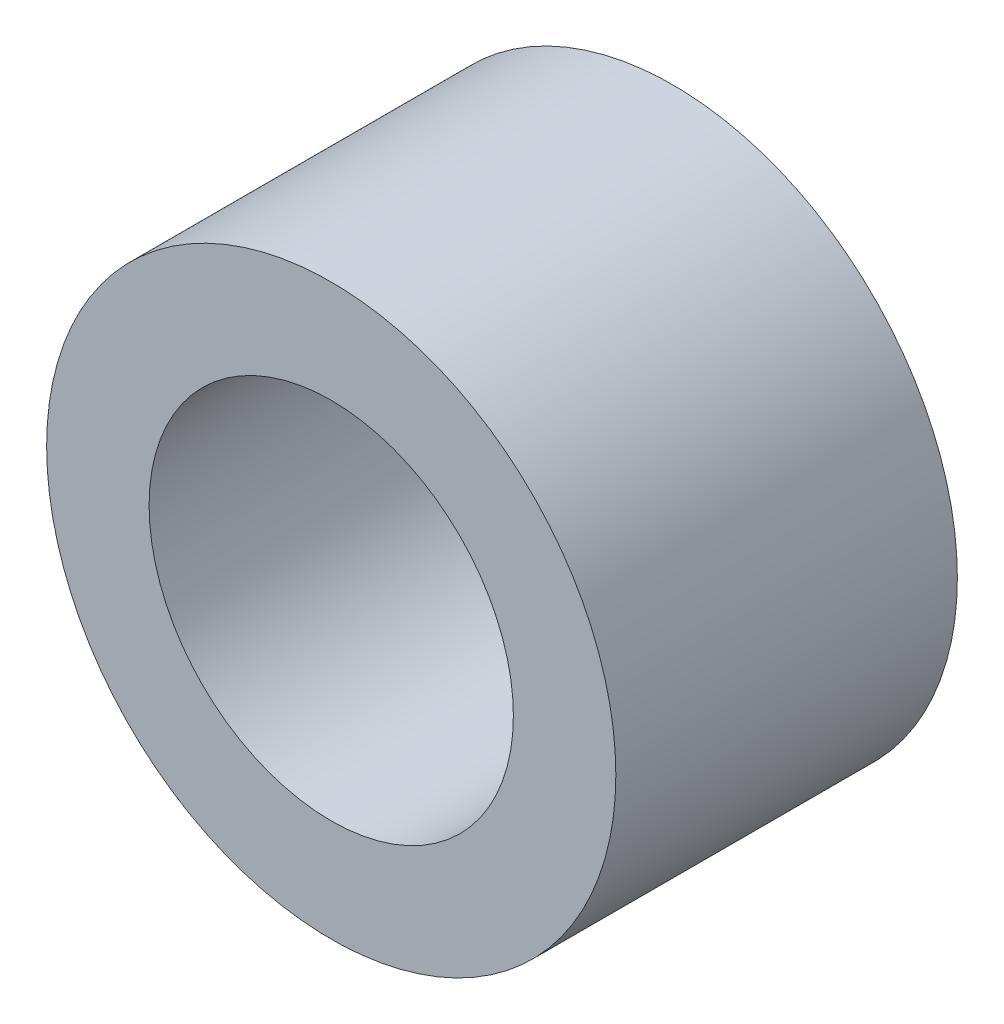
ISO-10303-21;
HEADER;
FILE_DESCRIPTION(('STEP AP214'),'2;1');
FILE_NAME('part.step','',(''),(''),'','','');
FILE_SCHEMA(('AUTOMOTIVE_DESIGN { 1 0 10303 214 1 1 1 1 }'));
ENDSEC;
DATA;
#1=APPLICATION_CONTEXT('core data for automotive mechanical design processes');
#2=APPLICATION_PROTOCOL_DEFINITION('international standard','automotive_design',2000,#1);
#3=PRODUCT_CONTEXT('',#1,'mechanical');
#4=PRODUCT('Part','Part','',(#3));
#5=PRODUCT_RELATED_PRODUCT_CATEGORY('part','',(#4));
#6=PRODUCT_DEFINITION_FORMATION('','',#4);
#7=PRODUCT_DEFINITION_CONTEXT('part definition',#1,'design');
#8=PRODUCT_DEFINITION('design','',#6,#7);
#9=PRODUCT_DEFINITION_SHAPE('','',#8);
#10=(LENGTH_UNIT() NAMED_UNIT(*) SI_UNIT(.MILLI.,.METRE.));
#11=(NAMED_UNIT(*) PLANE_ANGLE_UNIT() SI_UNIT($,.RADIAN.));
#12=(NAMED_UNIT(*) SI_UNIT($,.STERADIAN.) SOLID_ANGLE_UNIT());
#13=UNCERTAINTY_MEASURE_WITH_UNIT(LENGTH_MEASURE(1.E-05),#10,'distance_accuracy_value','');
#14=(GEOMETRIC_REPRESENTATION_CONTEXT(3) GLOBAL_UNCERTAINTY_ASSIGNED_CONTEXT((#13)) GLOBAL_UNIT_ASSIGNED_CONTEXT((#10,
#11,#12)) REPRESENTATION_CONTEXT('',''));
#15=CARTESIAN_POINT('',(0.,0.,0.));
#16=DIRECTION('',(0.,0.,1.));
#17=DIRECTION('',(1.,0.,0.));
#18=AXIS2_PLACEMENT_3D('',#15,#16,#17);
#19=CARTESIAN_POINT('',(0.,0.,3.));
#20=DIRECTION('',(0.,0.,1.));
#21=DIRECTION('',(1.,0.,0.));
#22=AXIS2_PLACEMENT_3D('',#19,#20,#21);
#23=PLANE('',#22);
#24=CARTESIAN_POINT('',(0.,0.,3.));
#25=DIRECTION('',(0.,0.,1.));
#26=DIRECTION('',(1.,0.,0.));
#27=AXIS2_PLACEMENT_3D('',#24,#25,#26);
#28=CIRCLE('',#27,2.5);
#29=CARTESIAN_POINT('',(2.5,0.,3.));
#30=VERTEX_POINT('',#29);
#31=EDGE_CURVE('E10',#30,#30,#28,.T.);
#32=ORIENTED_EDGE('',*,*,#31,.T.);
#33=EDGE_LOOP('',(#32));
#34=FACE_BOUND('',#33,.T.);
#35=CARTESIAN_POINT('',(0.,0.,3.));
#36=DIRECTION('',(0.,0.,1.));
#37=DIRECTION('',(1.,0.,0.));
#38=AXIS2_PLACEMENT_3D('',#35,#36,#37);
#39=CIRCLE('',#38,1.6);
#40=CARTESIAN_POINT('',(1.6,0.,3.));
#41=VERTEX_POINT('',#40);
#42=EDGE_CURVE('E54',#41,#41,#39,.T.);
#43=ORIENTED_EDGE('',*,*,#42,.F.);
#44=EDGE_LOOP('',(#43));
#45=FACE_BOUND('',#44,.T.);
#46=ADVANCED_FACE('F41',(#34,#45),#23,.T.);
#47=CARTESIAN_POINT('',(0.,0.,0.));
#48=DIRECTION('',(0.,0.,1.));
#49=DIRECTION('',(1.,0.,0.));
#50=AXIS2_PLACEMENT_3D('',#47,#48,#49);
#51=PLANE('',#50);
#52=CARTESIAN_POINT('',(0.,0.,0.));
#53=DIRECTION('',(0.,0.,1.));
#54=DIRECTION('',(1.,0.,0.));
#55=AXIS2_PLACEMENT_3D('',#52,#53,#54);
#56=CIRCLE('',#55,2.5);
#57=CARTESIAN_POINT('',(2.5,0.,0.));
#58=VERTEX_POINT('',#57);
#59=EDGE_CURVE('E45',#58,#58,#56,.T.);
#60=ORIENTED_EDGE('',*,*,#59,.F.);
#61=EDGE_LOOP('',(#60));
#62=FACE_BOUND('',#61,.T.);
#63=CARTESIAN_POINT('',(0.,0.,0.));
#64=DIRECTION('',(0.,0.,1.));
#65=DIRECTION('',(1.,0.,0.));
#66=AXIS2_PLACEMENT_3D('',#63,#64,#65);
#67=CIRCLE('',#66,1.6);
#68=CARTESIAN_POINT('',(1.6,0.,0.));
#69=VERTEX_POINT('',#68);
#70=EDGE_CURVE('E56',#69,#69,#67,.T.);
#71=ORIENTED_EDGE('',*,*,#70,.T.);
#72=EDGE_LOOP('',(#71));
#73=FACE_BOUND('',#72,.T.);
#74=ADVANCED_FACE('F68',(#62,#73),#51,.F.);
#75=CARTESIAN_POINT('',(0.,0.,3.));
#76=DIRECTION('',(0.,0.,-1.));
#77=DIRECTION('',(-1.,0.,0.));
#78=AXIS2_PLACEMENT_3D('',#75,#76,#77);
#79=CYLINDRICAL_SURFACE('',#78,2.5);
#80=ORIENTED_EDGE('',*,*,#31,.F.);
#81=EDGE_LOOP('',(#80));
#82=FACE_BOUND('',#81,.T.);
#83=ORIENTED_EDGE('',*,*,#59,.T.);
#84=EDGE_LOOP('',(#83));
#85=FACE_BOUND('',#84,.T.);
#86=ADVANCED_FACE('F43',(#82,#85),#79,.T.);
#87=CARTESIAN_POINT('',(0.,0.,3.));
#88=DIRECTION('',(0.,0.,-1.));
#89=DIRECTION('',(-1.,0.,0.));
#90=AXIS2_PLACEMENT_3D('',#87,#88,#89);
#91=CYLINDRICAL_SURFACE('',#90,1.6);
#92=ORIENTED_EDGE('',*,*,#42,.T.);
#93=EDGE_LOOP('',(#92));
#94=FACE_BOUND('',#93,.T.);
#95=ORIENTED_EDGE('',*,*,#70,.F.);
#96=EDGE_LOOP('',(#95));
#97=FACE_BOUND('',#96,.T.);
#98=ADVANCED_FACE('F64',(#94,#97),#91,.F.);
#99=CLOSED_SHELL('',(#46,#74,#86,#98));
#100=MANIFOLD_SOLID_BREP('B2',#99);
#101=ADVANCED_BREP_SHAPE_REPRESENTATION('',(#18,#100),#14);
#102=SHAPE_DEFINITION_REPRESENTATION(#9,#101);
ENDSEC;
END-ISO-10303-21;
